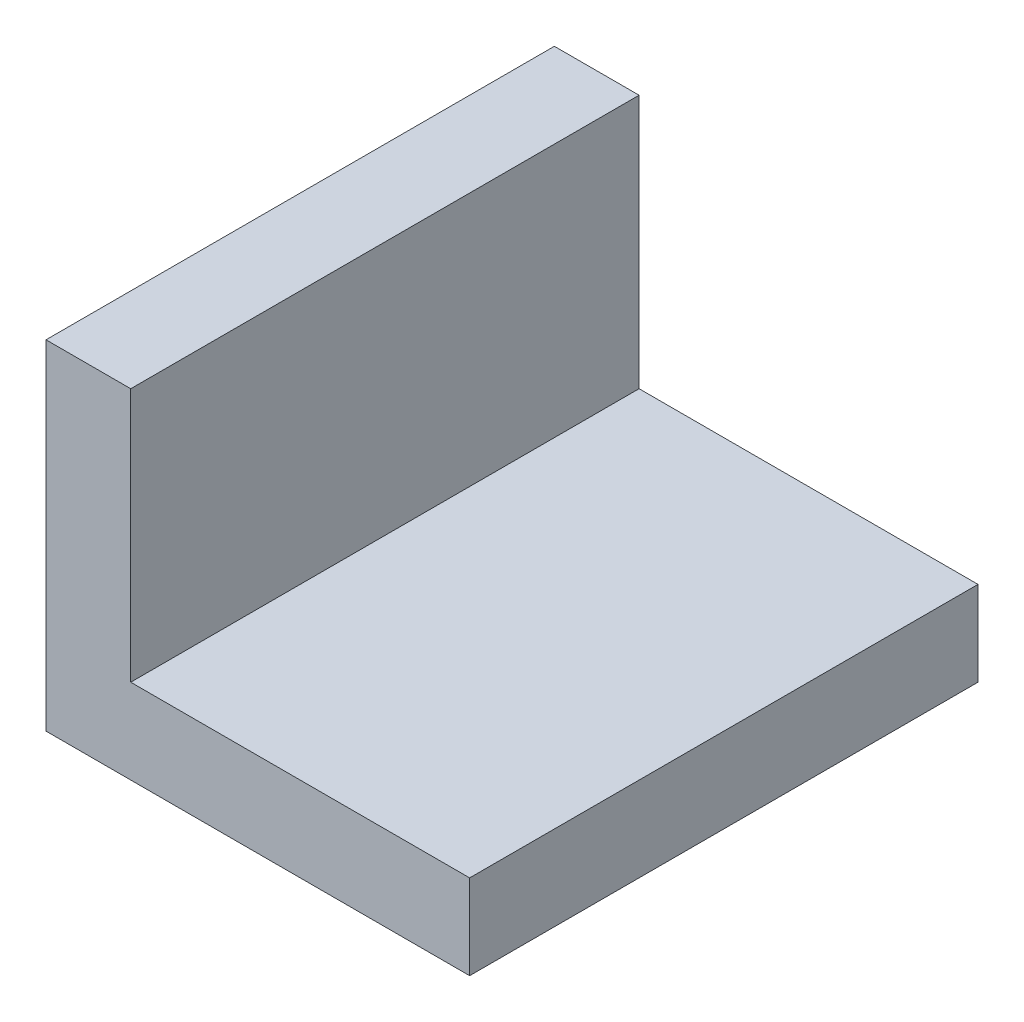
ISO-10303-21;
HEADER;
FILE_DESCRIPTION(('STEP AP214'),'2;1');
FILE_NAME('part.step','',(''),(''),'','','');
FILE_SCHEMA(('AUTOMOTIVE_DESIGN { 1 0 10303 214 1 1 1 1 }'));
ENDSEC;
DATA;
#1=APPLICATION_CONTEXT('core data for automotive mechanical design processes');
#2=APPLICATION_PROTOCOL_DEFINITION('international standard','automotive_design',2000,#1);
#3=PRODUCT_CONTEXT('',#1,'mechanical');
#4=PRODUCT('Part','Part','',(#3));
#5=PRODUCT_RELATED_PRODUCT_CATEGORY('part','',(#4));
#6=PRODUCT_DEFINITION_FORMATION('','',#4);
#7=PRODUCT_DEFINITION_CONTEXT('part definition',#1,'design');
#8=PRODUCT_DEFINITION('design','',#6,#7);
#9=PRODUCT_DEFINITION_SHAPE('','',#8);
#10=(LENGTH_UNIT() NAMED_UNIT(*) SI_UNIT(.MILLI.,.METRE.));
#11=(NAMED_UNIT(*) PLANE_ANGLE_UNIT() SI_UNIT($,.RADIAN.));
#12=(NAMED_UNIT(*) SI_UNIT($,.STERADIAN.) SOLID_ANGLE_UNIT());
#13=UNCERTAINTY_MEASURE_WITH_UNIT(LENGTH_MEASURE(1.E-05),#10,'distance_accuracy_value','');
#14=(GEOMETRIC_REPRESENTATION_CONTEXT(3) GLOBAL_UNCERTAINTY_ASSIGNED_CONTEXT((#13)) GLOBAL_UNIT_ASSIGNED_CONTEXT((#10,
#11,#12)) REPRESENTATION_CONTEXT('',''));
#15=CARTESIAN_POINT('',(0.,0.,0.));
#16=DIRECTION('',(0.,0.,1.));
#17=DIRECTION('',(1.,0.,0.));
#18=AXIS2_PLACEMENT_3D('',#15,#16,#17);
#19=CARTESIAN_POINT('',(3.,12.,18.));
#20=DIRECTION('',(0.,-1.,0.));
#21=DIRECTION('',(0.,0.,-1.));
#22=AXIS2_PLACEMENT_3D('',#19,#20,#21);
#23=PLANE('',#22);
#24=DIRECTION('',(-1.,0.,0.));
#25=VECTOR('',#24,1.);
#26=CARTESIAN_POINT('',(3.,12.,0.));
#27=LINE('',#26,#25);
#28=CARTESIAN_POINT('',(3.,12.,0.));
#29=VERTEX_POINT('',#28);
#30=CARTESIAN_POINT('',(0.,12.,0.));
#31=VERTEX_POINT('',#30);
#32=EDGE_CURVE('E114',#29,#31,#27,.T.);
#33=ORIENTED_EDGE('',*,*,#32,.T.);
#34=DIRECTION('',(0.,0.,-1.));
#35=VECTOR('',#34,1.);
#36=CARTESIAN_POINT('',(0.,12.,18.));
#37=LINE('',#36,#35);
#38=CARTESIAN_POINT('',(0.,12.,18.));
#39=VERTEX_POINT('',#38);
#40=EDGE_CURVE('E11',#39,#31,#37,.T.);
#41=ORIENTED_EDGE('',*,*,#40,.F.);
#42=DIRECTION('',(-1.,0.,0.));
#43=VECTOR('',#42,1.);
#44=CARTESIAN_POINT('',(3.,12.,18.));
#45=LINE('',#44,#43);
#46=CARTESIAN_POINT('',(3.,12.,18.));
#47=VERTEX_POINT('',#46);
#48=EDGE_CURVE('E124',#47,#39,#45,.T.);
#49=ORIENTED_EDGE('',*,*,#48,.F.);
#50=DIRECTION('',(0.,0.,-1.));
#51=VECTOR('',#50,1.);
#52=CARTESIAN_POINT('',(3.,12.,18.));
#53=LINE('',#52,#51);
#54=EDGE_CURVE('E110',#47,#29,#53,.T.);
#55=ORIENTED_EDGE('',*,*,#54,.T.);
#56=EDGE_LOOP('',(#33,#41,#49,#55));
#57=FACE_BOUND('',#56,.T.);
#58=ADVANCED_FACE('F30',(#57),#23,.F.);
#59=CARTESIAN_POINT('',(0.,12.,18.));
#60=DIRECTION('',(1.,0.,0.));
#61=DIRECTION('',(0.,1.,0.));
#62=AXIS2_PLACEMENT_3D('',#59,#60,#61);
#63=PLANE('',#62);
#64=DIRECTION('',(0.,-1.,0.));
#65=VECTOR('',#64,1.);
#66=CARTESIAN_POINT('',(0.,12.,0.));
#67=LINE('',#66,#65);
#68=CARTESIAN_POINT('',(0.,0.,0.));
#69=VERTEX_POINT('',#68);
#70=EDGE_CURVE('E117',#31,#69,#67,.T.);
#71=ORIENTED_EDGE('',*,*,#70,.T.);
#72=DIRECTION('',(0.,0.,-1.));
#73=VECTOR('',#72,1.);
#74=CARTESIAN_POINT('',(0.,0.,18.));
#75=LINE('',#74,#73);
#76=CARTESIAN_POINT('',(0.,0.,18.));
#77=VERTEX_POINT('',#76);
#78=EDGE_CURVE('E38',#77,#69,#75,.T.);
#79=ORIENTED_EDGE('',*,*,#78,.F.);
#80=DIRECTION('',(0.,-1.,0.));
#81=VECTOR('',#80,1.);
#82=CARTESIAN_POINT('',(0.,12.,18.));
#83=LINE('',#82,#81);
#84=EDGE_CURVE('E83',#39,#77,#83,.T.);
#85=ORIENTED_EDGE('',*,*,#84,.F.);
#86=ORIENTED_EDGE('',*,*,#40,.T.);
#87=EDGE_LOOP('',(#71,#79,#85,#86));
#88=FACE_BOUND('',#87,.T.);
#89=ADVANCED_FACE('F148',(#88),#63,.F.);
#90=CARTESIAN_POINT('',(0.,0.,18.));
#91=DIRECTION('',(0.,1.,0.));
#92=DIRECTION('',(0.,0.,1.));
#93=AXIS2_PLACEMENT_3D('',#90,#91,#92);
#94=PLANE('',#93);
#95=DIRECTION('',(1.,0.,0.));
#96=VECTOR('',#95,1.);
#97=CARTESIAN_POINT('',(0.,0.,0.));
#98=LINE('',#97,#96);
#99=CARTESIAN_POINT('',(15.,0.,0.));
#100=VERTEX_POINT('',#99);
#101=EDGE_CURVE('E119',#69,#100,#98,.T.);
#102=ORIENTED_EDGE('',*,*,#101,.T.);
#103=DIRECTION('',(0.,0.,-1.));
#104=VECTOR('',#103,1.);
#105=CARTESIAN_POINT('',(15.,0.,18.));
#106=LINE('',#105,#104);
#107=CARTESIAN_POINT('',(15.,0.,18.));
#108=VERTEX_POINT('',#107);
#109=EDGE_CURVE('E105',#108,#100,#106,.T.);
#110=ORIENTED_EDGE('',*,*,#109,.F.);
#111=DIRECTION('',(1.,0.,0.));
#112=VECTOR('',#111,1.);
#113=CARTESIAN_POINT('',(0.,0.,18.));
#114=LINE('',#113,#112);
#115=EDGE_CURVE('E96',#77,#108,#114,.T.);
#116=ORIENTED_EDGE('',*,*,#115,.F.);
#117=ORIENTED_EDGE('',*,*,#78,.T.);
#118=EDGE_LOOP('',(#102,#110,#116,#117));
#119=FACE_BOUND('',#118,.T.);
#120=ADVANCED_FACE('F130',(#119),#94,.F.);
#121=CARTESIAN_POINT('',(15.,0.,18.));
#122=DIRECTION('',(-1.,0.,0.));
#123=DIRECTION('',(0.,0.,1.));
#124=AXIS2_PLACEMENT_3D('',#121,#122,#123);
#125=PLANE('',#124);
#126=DIRECTION('',(0.,1.,0.));
#127=VECTOR('',#126,1.);
#128=CARTESIAN_POINT('',(15.,0.,0.));
#129=LINE('',#128,#127);
#130=CARTESIAN_POINT('',(15.,3.,0.));
#131=VERTEX_POINT('',#130);
#132=EDGE_CURVE('E104',#100,#131,#129,.T.);
#133=ORIENTED_EDGE('',*,*,#132,.T.);
#134=DIRECTION('',(0.,0.,-1.));
#135=VECTOR('',#134,1.);
#136=CARTESIAN_POINT('',(15.,3.,18.));
#137=LINE('',#136,#135);
#138=CARTESIAN_POINT('',(15.,3.,18.));
#139=VERTEX_POINT('',#138);
#140=EDGE_CURVE('E101',#139,#131,#137,.T.);
#141=ORIENTED_EDGE('',*,*,#140,.F.);
#142=DIRECTION('',(0.,1.,0.));
#143=VECTOR('',#142,1.);
#144=CARTESIAN_POINT('',(15.,0.,18.));
#145=LINE('',#144,#143);
#146=EDGE_CURVE('E90',#108,#139,#145,.T.);
#147=ORIENTED_EDGE('',*,*,#146,.F.);
#148=ORIENTED_EDGE('',*,*,#109,.T.);
#149=EDGE_LOOP('',(#133,#141,#147,#148));
#150=FACE_BOUND('',#149,.T.);
#151=ADVANCED_FACE('F102',(#150),#125,.F.);
#152=CARTESIAN_POINT('',(15.,3.,18.));
#153=DIRECTION('',(0.,-1.,0.));
#154=DIRECTION('',(1.,0.,0.));
#155=AXIS2_PLACEMENT_3D('',#152,#153,#154);
#156=PLANE('',#155);
#157=DIRECTION('',(-1.,0.,0.));
#158=VECTOR('',#157,1.);
#159=CARTESIAN_POINT('',(15.,3.,0.));
#160=LINE('',#159,#158);
#161=CARTESIAN_POINT('',(3.,3.,0.));
#162=VERTEX_POINT('',#161);
#163=EDGE_CURVE('E69',#131,#162,#160,.T.);
#164=ORIENTED_EDGE('',*,*,#163,.T.);
#165=DIRECTION('',(0.,0.,-1.));
#166=VECTOR('',#165,1.);
#167=CARTESIAN_POINT('',(3.,3.,18.));
#168=LINE('',#167,#166);
#169=CARTESIAN_POINT('',(3.,3.,18.));
#170=VERTEX_POINT('',#169);
#171=EDGE_CURVE('E106',#170,#162,#168,.T.);
#172=ORIENTED_EDGE('',*,*,#171,.F.);
#173=DIRECTION('',(-1.,0.,0.));
#174=VECTOR('',#173,1.);
#175=CARTESIAN_POINT('',(15.,3.,18.));
#176=LINE('',#175,#174);
#177=EDGE_CURVE('E94',#139,#170,#176,.T.);
#178=ORIENTED_EDGE('',*,*,#177,.F.);
#179=ORIENTED_EDGE('',*,*,#140,.T.);
#180=EDGE_LOOP('',(#164,#172,#178,#179));
#181=FACE_BOUND('',#180,.T.);
#182=ADVANCED_FACE('F108',(#181),#156,.F.);
#183=CARTESIAN_POINT('',(3.,3.,18.));
#184=DIRECTION('',(-1.,0.,0.));
#185=DIRECTION('',(0.,-1.,0.));
#186=AXIS2_PLACEMENT_3D('',#183,#184,#185);
#187=PLANE('',#186);
#188=DIRECTION('',(0.,1.,0.));
#189=VECTOR('',#188,1.);
#190=CARTESIAN_POINT('',(3.,3.,0.));
#191=LINE('',#190,#189);
#192=EDGE_CURVE('E75',#162,#29,#191,.T.);
#193=ORIENTED_EDGE('',*,*,#192,.T.);
#194=ORIENTED_EDGE('',*,*,#54,.F.);
#195=DIRECTION('',(0.,1.,0.));
#196=VECTOR('',#195,1.);
#197=CARTESIAN_POINT('',(3.,3.,18.));
#198=LINE('',#197,#196);
#199=EDGE_CURVE('E46',#170,#47,#198,.T.);
#200=ORIENTED_EDGE('',*,*,#199,.F.);
#201=ORIENTED_EDGE('',*,*,#171,.T.);
#202=EDGE_LOOP('',(#193,#194,#200,#201));
#203=FACE_BOUND('',#202,.T.);
#204=ADVANCED_FACE('F137',(#203),#187,.F.);
#205=CARTESIAN_POINT('',(0.,12.,18.));
#206=DIRECTION('',(0.,0.,1.));
#207=DIRECTION('',(1.,0.,0.));
#208=AXIS2_PLACEMENT_3D('',#205,#206,#207);
#209=PLANE('',#208);
#210=ORIENTED_EDGE('',*,*,#48,.T.);
#211=ORIENTED_EDGE('',*,*,#84,.T.);
#212=ORIENTED_EDGE('',*,*,#115,.T.);
#213=ORIENTED_EDGE('',*,*,#146,.T.);
#214=ORIENTED_EDGE('',*,*,#177,.T.);
#215=ORIENTED_EDGE('',*,*,#199,.T.);
#216=EDGE_LOOP('',(#210,#211,#212,#213,#214,#215));
#217=FACE_BOUND('',#216,.T.);
#218=ADVANCED_FACE('F92',(#217),#209,.T.);
#219=CARTESIAN_POINT('',(0.,12.,0.));
#220=DIRECTION('',(0.,0.,1.));
#221=DIRECTION('',(1.,0.,0.));
#222=AXIS2_PLACEMENT_3D('',#219,#220,#221);
#223=PLANE('',#222);
#224=ORIENTED_EDGE('',*,*,#32,.F.);
#225=ORIENTED_EDGE('',*,*,#192,.F.);
#226=ORIENTED_EDGE('',*,*,#163,.F.);
#227=ORIENTED_EDGE('',*,*,#132,.F.);
#228=ORIENTED_EDGE('',*,*,#101,.F.);
#229=ORIENTED_EDGE('',*,*,#70,.F.);
#230=EDGE_LOOP('',(#224,#225,#226,#227,#228,#229));
#231=FACE_BOUND('',#230,.T.);
#232=ADVANCED_FACE('F133',(#231),#223,.F.);
#233=CLOSED_SHELL('',(#58,#89,#120,#151,#182,#204,#218,#232));
#234=MANIFOLD_SOLID_BREP('B2',#233);
#235=ADVANCED_BREP_SHAPE_REPRESENTATION('',(#18,#234),#14);
#236=SHAPE_DEFINITION_REPRESENTATION(#9,#235);
ENDSEC;
END-ISO-10303-21;
